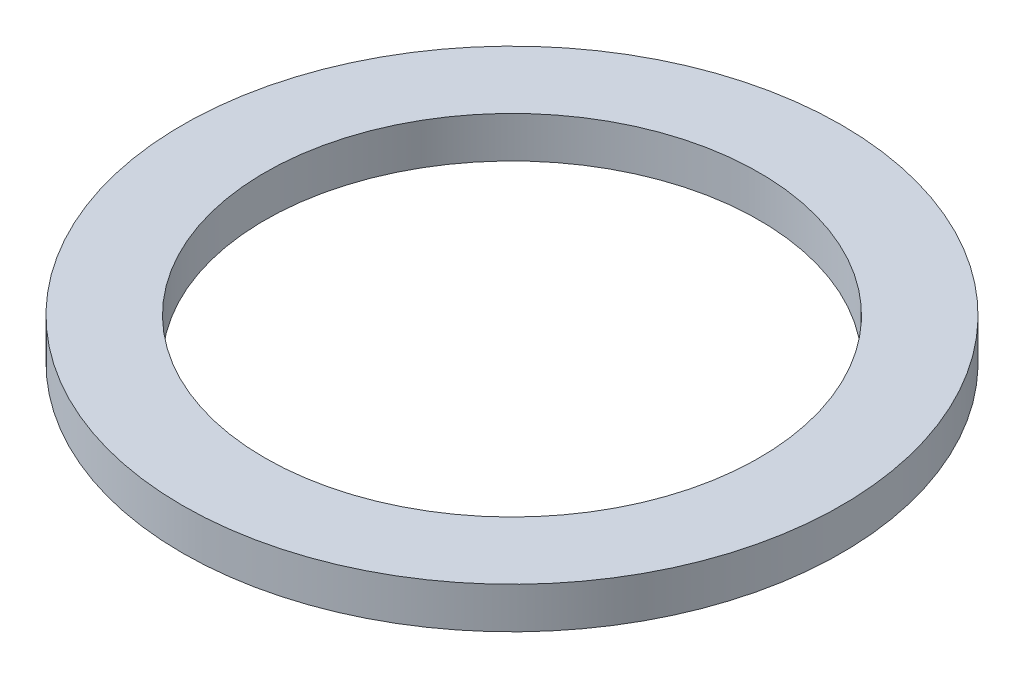
ISO-10303-21;
HEADER;
FILE_DESCRIPTION(('STEP AP214'),'2;1');
FILE_NAME('part.step','',(''),(''),'','','');
FILE_SCHEMA(('AUTOMOTIVE_DESIGN { 1 0 10303 214 1 1 1 1 }'));
ENDSEC;
DATA;
#1=APPLICATION_CONTEXT('core data for automotive mechanical design processes');
#2=APPLICATION_PROTOCOL_DEFINITION('international standard','automotive_design',2000,#1);
#3=PRODUCT_CONTEXT('',#1,'mechanical');
#4=PRODUCT('Part','Part','',(#3));
#5=PRODUCT_RELATED_PRODUCT_CATEGORY('part','',(#4));
#6=PRODUCT_DEFINITION_FORMATION('','',#4);
#7=PRODUCT_DEFINITION_CONTEXT('part definition',#1,'design');
#8=PRODUCT_DEFINITION('design','',#6,#7);
#9=PRODUCT_DEFINITION_SHAPE('','',#8);
#10=(LENGTH_UNIT() NAMED_UNIT(*) SI_UNIT(.MILLI.,.METRE.));
#11=(NAMED_UNIT(*) PLANE_ANGLE_UNIT() SI_UNIT($,.RADIAN.));
#12=(NAMED_UNIT(*) SI_UNIT($,.STERADIAN.) SOLID_ANGLE_UNIT());
#13=UNCERTAINTY_MEASURE_WITH_UNIT(LENGTH_MEASURE(1.E-05),#10,'distance_accuracy_value','');
#14=(GEOMETRIC_REPRESENTATION_CONTEXT(3) GLOBAL_UNCERTAINTY_ASSIGNED_CONTEXT((#13)) GLOBAL_UNIT_ASSIGNED_CONTEXT((#10,
#11,#12)) REPRESENTATION_CONTEXT('',''));
#15=CARTESIAN_POINT('',(0.,0.,0.));
#16=DIRECTION('',(0.,0.,1.));
#17=DIRECTION('',(1.,0.,0.));
#18=AXIS2_PLACEMENT_3D('',#15,#16,#17);
#19=CARTESIAN_POINT('',(0.,1.,0.));
#20=DIRECTION('',(0.,1.,0.));
#21=DIRECTION('',(0.,0.,1.));
#22=AXIS2_PLACEMENT_3D('',#19,#20,#21);
#23=PLANE('',#22);
#24=CARTESIAN_POINT('',(0.,1.,0.));
#25=DIRECTION('',(0.,1.,0.));
#26=DIRECTION('',(0.,0.,1.));
#27=AXIS2_PLACEMENT_3D('',#24,#25,#26);
#28=CIRCLE('',#27,8.);
#29=CARTESIAN_POINT('',(0.,1.,8.));
#30=VERTEX_POINT('',#29);
#31=EDGE_CURVE('E10',#30,#30,#28,.T.);
#32=ORIENTED_EDGE('',*,*,#31,.T.);
#33=EDGE_LOOP('',(#32));
#34=FACE_BOUND('',#33,.T.);
#35=CARTESIAN_POINT('',(0.,1.,0.));
#36=DIRECTION('',(0.,1.,0.));
#37=DIRECTION('',(0.,0.,1.));
#38=AXIS2_PLACEMENT_3D('',#35,#36,#37);
#39=CIRCLE('',#38,6.);
#40=CARTESIAN_POINT('',(0.,1.,6.));
#41=VERTEX_POINT('',#40);
#42=EDGE_CURVE('E42',#41,#41,#39,.T.);
#43=ORIENTED_EDGE('',*,*,#42,.F.);
#44=EDGE_LOOP('',(#43));
#45=FACE_BOUND('',#44,.T.);
#46=ADVANCED_FACE('F31',(#34,#45),#23,.T.);
#47=CARTESIAN_POINT('',(0.,0.,0.));
#48=DIRECTION('',(0.,1.,0.));
#49=DIRECTION('',(0.,0.,1.));
#50=AXIS2_PLACEMENT_3D('',#47,#48,#49);
#51=PLANE('',#50);
#52=CARTESIAN_POINT('',(0.,0.,0.));
#53=DIRECTION('',(0.,1.,0.));
#54=DIRECTION('',(0.,0.,1.));
#55=AXIS2_PLACEMENT_3D('',#52,#53,#54);
#56=CIRCLE('',#55,8.);
#57=CARTESIAN_POINT('',(0.,0.,8.));
#58=VERTEX_POINT('',#57);
#59=EDGE_CURVE('E35',#58,#58,#56,.T.);
#60=ORIENTED_EDGE('',*,*,#59,.F.);
#61=EDGE_LOOP('',(#60));
#62=FACE_BOUND('',#61,.T.);
#63=CARTESIAN_POINT('',(0.,0.,0.));
#64=DIRECTION('',(0.,1.,0.));
#65=DIRECTION('',(0.,0.,1.));
#66=AXIS2_PLACEMENT_3D('',#63,#64,#65);
#67=CIRCLE('',#66,6.);
#68=CARTESIAN_POINT('',(0.,0.,6.));
#69=VERTEX_POINT('',#68);
#70=EDGE_CURVE('E44',#69,#69,#67,.T.);
#71=ORIENTED_EDGE('',*,*,#70,.T.);
#72=EDGE_LOOP('',(#71));
#73=FACE_BOUND('',#72,.T.);
#74=ADVANCED_FACE('F54',(#62,#73),#51,.F.);
#75=CARTESIAN_POINT('',(0.,1.,0.));
#76=DIRECTION('',(0.,-1.,0.));
#77=DIRECTION('',(0.,0.,-1.));
#78=AXIS2_PLACEMENT_3D('',#75,#76,#77);
#79=CYLINDRICAL_SURFACE('',#78,8.);
#80=ORIENTED_EDGE('',*,*,#31,.F.);
#81=EDGE_LOOP('',(#80));
#82=FACE_BOUND('',#81,.T.);
#83=ORIENTED_EDGE('',*,*,#59,.T.);
#84=EDGE_LOOP('',(#83));
#85=FACE_BOUND('',#84,.T.);
#86=ADVANCED_FACE('F33',(#82,#85),#79,.T.);
#87=CARTESIAN_POINT('',(0.,1.,0.));
#88=DIRECTION('',(0.,-1.,0.));
#89=DIRECTION('',(0.,0.,-1.));
#90=AXIS2_PLACEMENT_3D('',#87,#88,#89);
#91=CYLINDRICAL_SURFACE('',#90,6.);
#92=ORIENTED_EDGE('',*,*,#42,.T.);
#93=EDGE_LOOP('',(#92));
#94=FACE_BOUND('',#93,.T.);
#95=ORIENTED_EDGE('',*,*,#70,.F.);
#96=EDGE_LOOP('',(#95));
#97=FACE_BOUND('',#96,.T.);
#98=ADVANCED_FACE('F50',(#94,#97),#91,.F.);
#99=CLOSED_SHELL('',(#46,#74,#86,#98));
#100=MANIFOLD_SOLID_BREP('B2',#99);
#101=ADVANCED_BREP_SHAPE_REPRESENTATION('',(#18,#100),#14);
#102=SHAPE_DEFINITION_REPRESENTATION(#9,#101);
ENDSEC;
END-ISO-10303-21;
